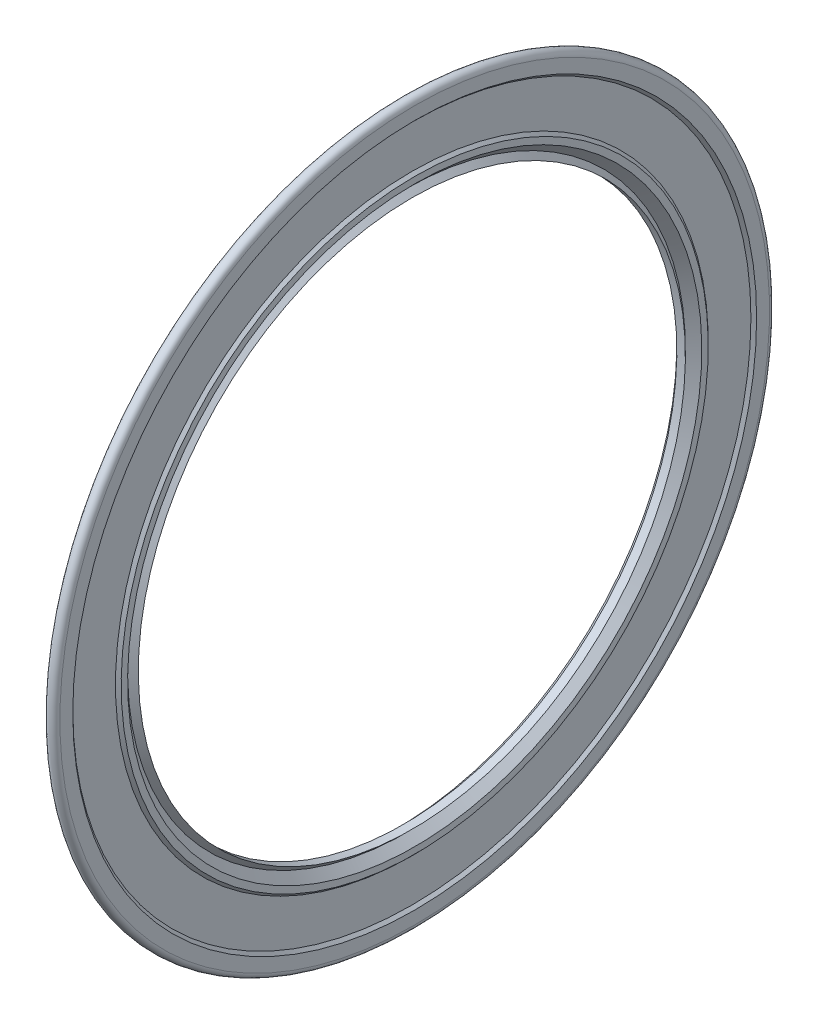
ISO-10303-21;
HEADER;
FILE_DESCRIPTION(('STEP AP214'),'2;1');
FILE_NAME('part.step','',(''),(''),'','','');
FILE_SCHEMA(('AUTOMOTIVE_DESIGN { 1 0 10303 214 1 1 1 1 }'));
ENDSEC;
DATA;
#1=APPLICATION_CONTEXT('core data for automotive mechanical design processes');
#2=APPLICATION_PROTOCOL_DEFINITION('international standard','automotive_design',2000,#1);
#3=PRODUCT_CONTEXT('',#1,'mechanical');
#4=PRODUCT('Part','Part','',(#3));
#5=PRODUCT_RELATED_PRODUCT_CATEGORY('part','',(#4));
#6=PRODUCT_DEFINITION_FORMATION('','',#4);
#7=PRODUCT_DEFINITION_CONTEXT('part definition',#1,'design');
#8=PRODUCT_DEFINITION('design','',#6,#7);
#9=PRODUCT_DEFINITION_SHAPE('','',#8);
#10=(LENGTH_UNIT() NAMED_UNIT(*) SI_UNIT(.MILLI.,.METRE.));
#11=(NAMED_UNIT(*) PLANE_ANGLE_UNIT() SI_UNIT($,.RADIAN.));
#12=(NAMED_UNIT(*) SI_UNIT($,.STERADIAN.) SOLID_ANGLE_UNIT());
#13=UNCERTAINTY_MEASURE_WITH_UNIT(LENGTH_MEASURE(1.E-05),#10,'distance_accuracy_value','');
#14=(GEOMETRIC_REPRESENTATION_CONTEXT(3) GLOBAL_UNCERTAINTY_ASSIGNED_CONTEXT((#13)) GLOBAL_UNIT_ASSIGNED_CONTEXT((#10,
#11,#12)) REPRESENTATION_CONTEXT('',''));
#15=CARTESIAN_POINT('',(0.,0.,0.));
#16=DIRECTION('',(0.,0.,1.));
#17=DIRECTION('',(1.,0.,0.));
#18=AXIS2_PLACEMENT_3D('',#15,#16,#17);
#19=CARTESIAN_POINT('',(20.64,43.9311,0.));
#20=DIRECTION('',(1.,0.,0.));
#21=DIRECTION('',(0.,-1.,0.));
#22=AXIS2_PLACEMENT_3D('',#19,#20,#21);
#23=PLANE('',#22);
#24=CARTESIAN_POINT('',(20.64,0.,0.));
#25=DIRECTION('',(-1.,0.,0.));
#26=DIRECTION('',(0.,1.,0.));
#27=AXIS2_PLACEMENT_3D('',#24,#25,#26);
#28=CIRCLE('',#27,43.1175);
#29=CARTESIAN_POINT('',(20.64,43.1175,0.));
#30=VERTEX_POINT('',#29);
#31=EDGE_CURVE('E11',#30,#30,#28,.T.);
#32=ORIENTED_EDGE('',*,*,#31,.T.);
#33=EDGE_LOOP('',(#32));
#34=FACE_BOUND('',#33,.T.);
#35=CARTESIAN_POINT('',(20.64,0.,0.));
#36=DIRECTION('',(-1.,0.,0.));
#37=DIRECTION('',(0.,1.,0.));
#38=AXIS2_PLACEMENT_3D('',#35,#36,#37);
#39=CIRCLE('',#38,44.7447);
#40=CARTESIAN_POINT('',(20.64,44.7447,0.));
#41=VERTEX_POINT('',#40);
#42=EDGE_CURVE('E20',#41,#41,#39,.T.);
#43=ORIENTED_EDGE('',*,*,#42,.F.);
#44=EDGE_LOOP('',(#43));
#45=FACE_BOUND('',#44,.T.);
#46=ADVANCED_FACE('F16',(#34,#45),#23,.T.);
#47=CARTESIAN_POINT('',(20.46,0.,0.));
#48=DIRECTION('',(1.,0.,0.));
#49=DIRECTION('',(0.,1.,0.));
#50=AXIS2_PLACEMENT_3D('',#47,#48,#49);
#51=CONICAL_SURFACE('',#50,42.9375,0.785398163397446);
#52=CARTESIAN_POINT('',(20.28,0.,0.));
#53=DIRECTION('',(-1.,0.,0.));
#54=DIRECTION('',(0.,1.,0.));
#55=AXIS2_PLACEMENT_3D('',#52,#53,#54);
#56=CIRCLE('',#55,42.7575);
#57=CARTESIAN_POINT('',(20.28,42.7575,0.));
#58=VERTEX_POINT('',#57);
#59=EDGE_CURVE('E26',#58,#58,#56,.T.);
#60=ORIENTED_EDGE('',*,*,#59,.T.);
#61=EDGE_LOOP('',(#60));
#62=FACE_BOUND('',#61,.T.);
#63=ORIENTED_EDGE('',*,*,#31,.F.);
#64=EDGE_LOOP('',(#63));
#65=FACE_BOUND('',#64,.T.);
#66=ADVANCED_FACE('F88',(#62,#65),#51,.F.);
#67=CARTESIAN_POINT('',(20.28,40.0665,0.));
#68=DIRECTION('',(1.,0.,0.));
#69=DIRECTION('',(0.,-1.,0.));
#70=AXIS2_PLACEMENT_3D('',#67,#68,#69);
#71=PLANE('',#70);
#72=CARTESIAN_POINT('',(20.28,0.,0.));
#73=DIRECTION('',(-1.,0.,0.));
#74=DIRECTION('',(0.,1.,0.));
#75=AXIS2_PLACEMENT_3D('',#72,#73,#74);
#76=CIRCLE('',#75,37.3755);
#77=CARTESIAN_POINT('',(20.28,37.3755,0.));
#78=VERTEX_POINT('',#77);
#79=EDGE_CURVE('E82',#78,#78,#76,.T.);
#80=ORIENTED_EDGE('',*,*,#79,.T.);
#81=EDGE_LOOP('',(#80));
#82=FACE_BOUND('',#81,.T.);
#83=ORIENTED_EDGE('',*,*,#59,.F.);
#84=EDGE_LOOP('',(#83));
#85=FACE_BOUND('',#84,.T.);
#86=ADVANCED_FACE('F91',(#82,#85),#71,.T.);
#87=CARTESIAN_POINT('',(20.46,0.,0.));
#88=DIRECTION('',(-1.,0.,0.));
#89=DIRECTION('',(0.,1.,0.));
#90=AXIS2_PLACEMENT_3D('',#87,#88,#89);
#91=CONICAL_SURFACE('',#90,37.1955,0.785398163397446);
#92=CARTESIAN_POINT('',(20.64,0.,0.));
#93=DIRECTION('',(-1.,0.,0.));
#94=DIRECTION('',(0.,1.,0.));
#95=AXIS2_PLACEMENT_3D('',#92,#93,#94);
#96=CIRCLE('',#95,37.0155);
#97=CARTESIAN_POINT('',(20.64,37.0155,0.));
#98=VERTEX_POINT('',#97);
#99=EDGE_CURVE('E84',#98,#98,#96,.T.);
#100=ORIENTED_EDGE('',*,*,#99,.T.);
#101=EDGE_LOOP('',(#100));
#102=FACE_BOUND('',#101,.T.);
#103=ORIENTED_EDGE('',*,*,#79,.F.);
#104=EDGE_LOOP('',(#103));
#105=FACE_BOUND('',#104,.T.);
#106=ADVANCED_FACE('F93',(#102,#105),#91,.T.);
#107=CARTESIAN_POINT('',(20.64,36.6087,0.));
#108=DIRECTION('',(1.,0.,0.));
#109=DIRECTION('',(0.,-1.,0.));
#110=AXIS2_PLACEMENT_3D('',#107,#108,#109);
#111=PLANE('',#110);
#112=CARTESIAN_POINT('',(20.64,0.,0.));
#113=DIRECTION('',(-1.,0.,0.));
#114=DIRECTION('',(0.,1.,0.));
#115=AXIS2_PLACEMENT_3D('',#112,#113,#114);
#116=CIRCLE('',#115,36.2019);
#117=CARTESIAN_POINT('',(20.64,36.2019,0.));
#118=VERTEX_POINT('',#117);
#119=EDGE_CURVE('E85',#118,#118,#116,.T.);
#120=ORIENTED_EDGE('',*,*,#119,.T.);
#121=EDGE_LOOP('',(#120));
#122=FACE_BOUND('',#121,.T.);
#123=ORIENTED_EDGE('',*,*,#99,.F.);
#124=EDGE_LOOP('',(#123));
#125=FACE_BOUND('',#124,.T.);
#126=ADVANCED_FACE('F101',(#122,#125),#111,.T.);
#127=CARTESIAN_POINT('',(20.1233925,0.,0.));
#128=DIRECTION('',(1.,0.,0.));
#129=DIRECTION('',(0.,1.,0.));
#130=AXIS2_PLACEMENT_3D('',#127,#128,#129);
#131=CONICAL_SURFACE('',#130,35.6852925,0.78539816339745);
#132=CARTESIAN_POINT('',(19.606785,0.,0.));
#133=DIRECTION('',(-1.,0.,0.));
#134=DIRECTION('',(0.,1.,0.));
#135=AXIS2_PLACEMENT_3D('',#132,#133,#134);
#136=CIRCLE('',#135,35.168685);
#137=CARTESIAN_POINT('',(19.606785,35.168685,0.));
#138=VERTEX_POINT('',#137);
#139=EDGE_CURVE('E156',#138,#138,#136,.T.);
#140=ORIENTED_EDGE('',*,*,#139,.T.);
#141=EDGE_LOOP('',(#140));
#142=FACE_BOUND('',#141,.T.);
#143=ORIENTED_EDGE('',*,*,#119,.F.);
#144=EDGE_LOOP('',(#143));
#145=FACE_BOUND('',#144,.T.);
#146=ADVANCED_FACE('F115',(#142,#145),#131,.F.);
#147=CARTESIAN_POINT('',(19.9433925,0.,0.));
#148=DIRECTION('',(-1.,0.,0.));
#149=DIRECTION('',(0.,1.,0.));
#150=AXIS2_PLACEMENT_3D('',#147,#148,#149);
#151=CONICAL_SURFACE('',#150,34.8320775,0.785398163397443);
#152=CARTESIAN_POINT('',(20.28,0.,0.));
#153=DIRECTION('',(-1.,0.,0.));
#154=DIRECTION('',(0.,1.,0.));
#155=AXIS2_PLACEMENT_3D('',#152,#153,#154);
#156=CIRCLE('',#155,34.49547);
#157=CARTESIAN_POINT('',(20.28,34.49547,0.));
#158=VERTEX_POINT('',#157);
#159=EDGE_CURVE('E74',#158,#158,#156,.T.);
#160=ORIENTED_EDGE('',*,*,#159,.T.);
#161=EDGE_LOOP('',(#160));
#162=FACE_BOUND('',#161,.T.);
#163=ORIENTED_EDGE('',*,*,#139,.F.);
#164=EDGE_LOOP('',(#163));
#165=FACE_BOUND('',#164,.T.);
#166=ADVANCED_FACE('F111',(#162,#165),#151,.T.);
#167=CARTESIAN_POINT('',(19.74,0.,0.));
#168=DIRECTION('',(1.,0.,0.));
#169=DIRECTION('',(0.,1.,0.));
#170=AXIS2_PLACEMENT_3D('',#167,#168,#169);
#171=CYLINDRICAL_SURFACE('',#170,34.49547);
#172=CARTESIAN_POINT('',(19.2,0.,0.));
#173=DIRECTION('',(-1.,0.,0.));
#174=DIRECTION('',(0.,1.,0.));
#175=AXIS2_PLACEMENT_3D('',#172,#173,#174);
#176=CIRCLE('',#175,34.49547);
#177=CARTESIAN_POINT('',(19.2,34.49547,0.));
#178=VERTEX_POINT('',#177);
#179=EDGE_CURVE('E78',#178,#178,#176,.T.);
#180=ORIENTED_EDGE('',*,*,#179,.T.);
#181=EDGE_LOOP('',(#180));
#182=FACE_BOUND('',#181,.T.);
#183=ORIENTED_EDGE('',*,*,#159,.F.);
#184=EDGE_LOOP('',(#183));
#185=FACE_BOUND('',#184,.T.);
#186=ADVANCED_FACE('F114',(#182,#185),#171,.F.);
#187=CARTESIAN_POINT('',(18.8633925,0.,0.));
#188=DIRECTION('',(-1.,0.,0.));
#189=DIRECTION('',(0.,1.,0.));
#190=AXIS2_PLACEMENT_3D('',#187,#188,#189);
#191=CONICAL_SURFACE('',#190,34.8320775,0.785398163397446);
#192=CARTESIAN_POINT('',(18.526785,0.,0.));
#193=DIRECTION('',(-1.,0.,0.));
#194=DIRECTION('',(0.,1.,0.));
#195=AXIS2_PLACEMENT_3D('',#192,#193,#194);
#196=CIRCLE('',#195,35.168685);
#197=CARTESIAN_POINT('',(18.526785,35.168685,0.));
#198=VERTEX_POINT('',#197);
#199=EDGE_CURVE('E76',#198,#198,#196,.T.);
#200=ORIENTED_EDGE('',*,*,#199,.T.);
#201=EDGE_LOOP('',(#200));
#202=FACE_BOUND('',#201,.T.);
#203=ORIENTED_EDGE('',*,*,#179,.F.);
#204=EDGE_LOOP('',(#203));
#205=FACE_BOUND('',#204,.T.);
#206=ADVANCED_FACE('F147',(#202,#205),#191,.F.);
#207=CARTESIAN_POINT('',(19.0433925,0.,0.));
#208=DIRECTION('',(1.,0.,0.));
#209=DIRECTION('',(0.,1.,0.));
#210=AXIS2_PLACEMENT_3D('',#207,#208,#209);
#211=CONICAL_SURFACE('',#210,35.6852925,0.785398163397453);
#212=CARTESIAN_POINT('',(19.56,0.,0.));
#213=DIRECTION('',(-1.,0.,0.));
#214=DIRECTION('',(0.,1.,0.));
#215=AXIS2_PLACEMENT_3D('',#212,#213,#214);
#216=CIRCLE('',#215,36.2019);
#217=CARTESIAN_POINT('',(19.56,36.2019,0.));
#218=VERTEX_POINT('',#217);
#219=EDGE_CURVE('E79',#218,#218,#216,.T.);
#220=ORIENTED_EDGE('',*,*,#219,.T.);
#221=EDGE_LOOP('',(#220));
#222=FACE_BOUND('',#221,.T.);
#223=ORIENTED_EDGE('',*,*,#199,.F.);
#224=EDGE_LOOP('',(#223));
#225=FACE_BOUND('',#224,.T.);
#226=ADVANCED_FACE('F134',(#222,#225),#211,.T.);
#227=CARTESIAN_POINT('',(19.2,0.,0.));
#228=DIRECTION('',(-1.,0.,0.));
#229=DIRECTION('',(0.,1.,0.));
#230=AXIS2_PLACEMENT_3D('',#227,#228,#229);
#231=CONICAL_SURFACE('',#230,36.5619,0.785398163397446);
#232=CARTESIAN_POINT('',(18.84,0.,0.));
#233=DIRECTION('',(-1.,0.,0.));
#234=DIRECTION('',(0.,1.,0.));
#235=AXIS2_PLACEMENT_3D('',#232,#233,#234);
#236=CIRCLE('',#235,36.9219);
#237=CARTESIAN_POINT('',(18.84,36.9219,0.));
#238=VERTEX_POINT('',#237);
#239=EDGE_CURVE('E161',#238,#238,#236,.T.);
#240=ORIENTED_EDGE('',*,*,#239,.T.);
#241=EDGE_LOOP('',(#240));
#242=FACE_BOUND('',#241,.T.);
#243=ORIENTED_EDGE('',*,*,#219,.F.);
#244=EDGE_LOOP('',(#243));
#245=FACE_BOUND('',#244,.T.);
#246=ADVANCED_FACE('F128',(#242,#245),#231,.F.);
#247=CARTESIAN_POINT('',(18.84,39.8439651913382,0.));
#248=DIRECTION('',(-1.,0.,0.));
#249=DIRECTION('',(0.,1.,0.));
#250=AXIS2_PLACEMENT_3D('',#247,#248,#249);
#251=PLANE('',#250);
#252=CARTESIAN_POINT('',(18.84,0.,0.));
#253=DIRECTION('',(-1.,0.,0.));
#254=DIRECTION('',(0.,1.,0.));
#255=AXIS2_PLACEMENT_3D('',#252,#253,#254);
#256=CIRCLE('',#255,42.7660303826763);
#257=CARTESIAN_POINT('',(18.84,42.7660303826763,0.));
#258=VERTEX_POINT('',#257);
#259=EDGE_CURVE('E71',#258,#258,#256,.T.);
#260=ORIENTED_EDGE('',*,*,#259,.T.);
#261=EDGE_LOOP('',(#260));
#262=FACE_BOUND('',#261,.T.);
#263=ORIENTED_EDGE('',*,*,#239,.F.);
#264=EDGE_LOOP('',(#263));
#265=FACE_BOUND('',#264,.T.);
#266=ADVANCED_FACE('F123',(#262,#265),#251,.T.);
#267=CARTESIAN_POINT('',(19.0254692089156,0.,0.));
#268=DIRECTION('',(1.,0.,0.));
#269=DIRECTION('',(0.,1.,0.));
#270=AXIS2_PLACEMENT_3D('',#267,#268,#269);
#271=CONICAL_SURFACE('',#270,43.8178785352982,1.39626340159546);
#272=CARTESIAN_POINT('',(19.2109384178312,0.,0.));
#273=DIRECTION('',(-1.,0.,0.));
#274=DIRECTION('',(0.,1.,0.));
#275=AXIS2_PLACEMENT_3D('',#272,#273,#274);
#276=CIRCLE('',#275,44.8697266879202);
#277=CARTESIAN_POINT('',(19.2109384178312,44.8697266879202,0.));
#278=VERTEX_POINT('',#277);
#279=EDGE_CURVE('E67',#278,#278,#276,.T.);
#280=ORIENTED_EDGE('',*,*,#279,.T.);
#281=EDGE_LOOP('',(#280));
#282=FACE_BOUND('',#281,.T.);
#283=ORIENTED_EDGE('',*,*,#259,.F.);
#284=EDGE_LOOP('',(#283));
#285=FACE_BOUND('',#284,.T.);
#286=ADVANCED_FACE('F18',(#282,#285),#271,.T.);
#287=CARTESIAN_POINT('',(19.92,0.,0.));
#288=DIRECTION('',(-1.,0.,0.));
#289=DIRECTION('',(0.,0.,1.));
#290=AXIS2_PLACEMENT_3D('',#287,#288,#289);
#291=TOROIDAL_SURFACE('',#290,44.7447,0.72);
#292=ORIENTED_EDGE('',*,*,#42,.T.);
#293=EDGE_LOOP('',(#292));
#294=FACE_BOUND('',#293,.T.);
#295=ORIENTED_EDGE('',*,*,#279,.F.);
#296=EDGE_LOOP('',(#295));
#297=FACE_BOUND('',#296,.T.);
#298=ADVANCED_FACE('F117',(#294,#297),#291,.T.);
#299=CLOSED_SHELL('',(#46,#66,#86,#106,#126,#146,#166,#186,#206,#226,#246,#266,#286,#298));
#300=MANIFOLD_SOLID_BREP('B1',#299);
#301=ADVANCED_BREP_SHAPE_REPRESENTATION('',(#18,#300),#14);
#302=SHAPE_DEFINITION_REPRESENTATION(#9,#301);
ENDSEC;
END-ISO-10303-21;
